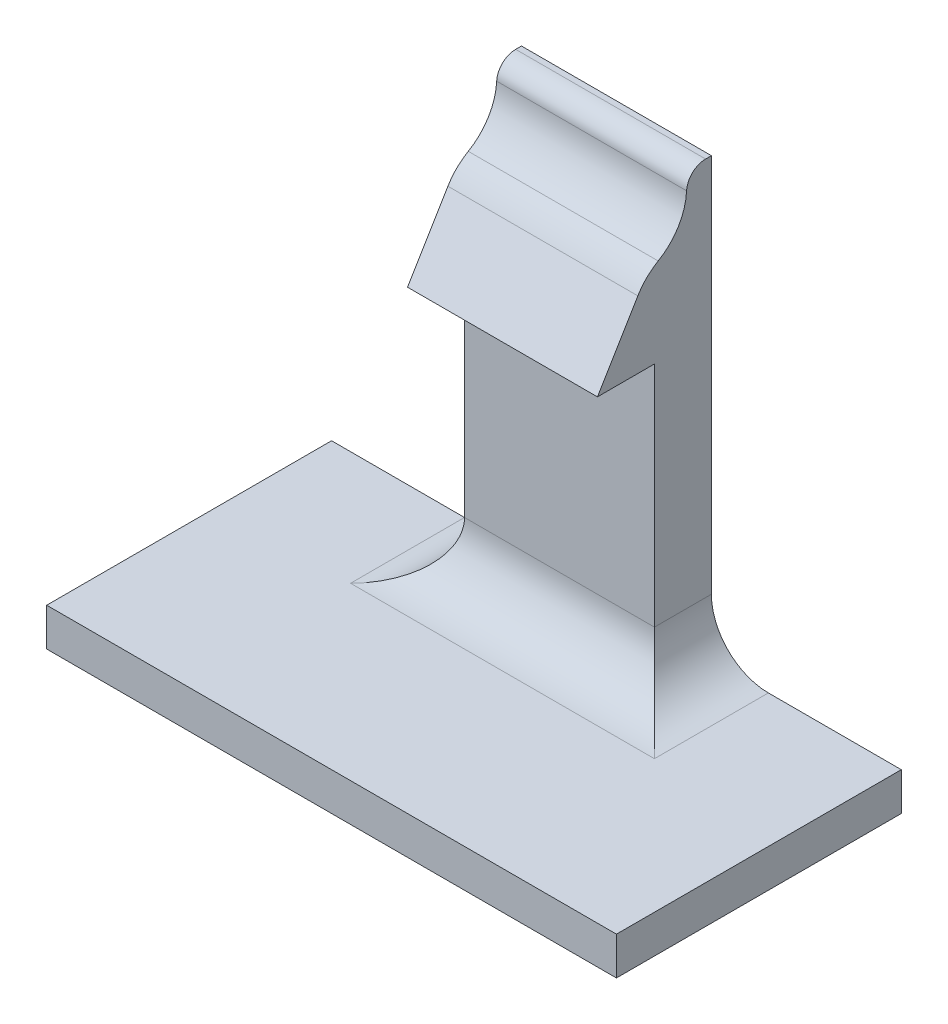
ISO-10303-21;
HEADER;
FILE_DESCRIPTION(('STEP AP214'),'2;1');
FILE_NAME('part.step','',(''),(''),'','','');
FILE_SCHEMA(('AUTOMOTIVE_DESIGN { 1 0 10303 214 1 1 1 1 }'));
ENDSEC;
DATA;
#1=APPLICATION_CONTEXT('core data for automotive mechanical design processes');
#2=APPLICATION_PROTOCOL_DEFINITION('international standard','automotive_design',2000,#1);
#3=PRODUCT_CONTEXT('',#1,'mechanical');
#4=PRODUCT('Part','Part','',(#3));
#5=PRODUCT_RELATED_PRODUCT_CATEGORY('part','',(#4));
#6=PRODUCT_DEFINITION_FORMATION('','',#4);
#7=PRODUCT_DEFINITION_CONTEXT('part definition',#1,'design');
#8=PRODUCT_DEFINITION('design','',#6,#7);
#9=PRODUCT_DEFINITION_SHAPE('','',#8);
#10=(LENGTH_UNIT() NAMED_UNIT(*) SI_UNIT(.MILLI.,.METRE.));
#11=(NAMED_UNIT(*) PLANE_ANGLE_UNIT() SI_UNIT($,.RADIAN.));
#12=(NAMED_UNIT(*) SI_UNIT($,.STERADIAN.) SOLID_ANGLE_UNIT());
#13=UNCERTAINTY_MEASURE_WITH_UNIT(LENGTH_MEASURE(1.E-05),#10,'distance_accuracy_value','');
#14=(GEOMETRIC_REPRESENTATION_CONTEXT(3) GLOBAL_UNCERTAINTY_ASSIGNED_CONTEXT((#13)) GLOBAL_UNIT_ASSIGNED_CONTEXT((#10,
#11,#12)) REPRESENTATION_CONTEXT('',''));
#15=CARTESIAN_POINT('',(0.,0.,0.));
#16=DIRECTION('',(0.,0.,1.));
#17=DIRECTION('',(1.,0.,0.));
#18=AXIS2_PLACEMENT_3D('',#15,#16,#17);
#19=CARTESIAN_POINT('',(15.,2.,-7.5));
#20=DIRECTION('',(-1.,0.,0.));
#21=DIRECTION('',(0.,0.,1.));
#22=AXIS2_PLACEMENT_3D('',#19,#20,#21);
#23=PLANE('',#22);
#24=DIRECTION('',(0.,0.,-1.));
#25=VECTOR('',#24,1.);
#26=CARTESIAN_POINT('',(15.,0.,-7.5));
#27=LINE('',#26,#25);
#28=CARTESIAN_POINT('',(15.,0.,7.5));
#29=VERTEX_POINT('',#28);
#30=CARTESIAN_POINT('',(15.,0.,-7.5));
#31=VERTEX_POINT('',#30);
#32=EDGE_CURVE('E205',#29,#31,#27,.T.);
#33=ORIENTED_EDGE('',*,*,#32,.T.);
#34=DIRECTION('',(0.,-1.,0.));
#35=VECTOR('',#34,1.);
#36=CARTESIAN_POINT('',(15.,2.,-7.5));
#37=LINE('',#36,#35);
#38=CARTESIAN_POINT('',(15.,2.,-7.5));
#39=VERTEX_POINT('',#38);
#40=EDGE_CURVE('E245',#39,#31,#37,.T.);
#41=ORIENTED_EDGE('',*,*,#40,.F.);
#42=DIRECTION('',(0.,0.,-1.));
#43=VECTOR('',#42,1.);
#44=CARTESIAN_POINT('',(15.,2.,-7.5));
#45=LINE('',#44,#43);
#46=CARTESIAN_POINT('',(15.,2.,7.5));
#47=VERTEX_POINT('',#46);
#48=EDGE_CURVE('E206',#47,#39,#45,.T.);
#49=ORIENTED_EDGE('',*,*,#48,.F.);
#50=DIRECTION('',(0.,-1.,0.));
#51=VECTOR('',#50,1.);
#52=CARTESIAN_POINT('',(15.,2.,7.5));
#53=LINE('',#52,#51);
#54=EDGE_CURVE('E222',#47,#29,#53,.T.);
#55=ORIENTED_EDGE('',*,*,#54,.T.);
#56=EDGE_LOOP('',(#33,#41,#49,#55));
#57=FACE_BOUND('',#56,.T.);
#58=ADVANCED_FACE('F39',(#57),#23,.F.);
#59=CARTESIAN_POINT('',(-15.,2.,-7.5));
#60=DIRECTION('',(0.,0.,1.));
#61=DIRECTION('',(1.,0.,0.));
#62=AXIS2_PLACEMENT_3D('',#59,#60,#61);
#63=PLANE('',#62);
#64=DIRECTION('',(-1.,0.,0.));
#65=VECTOR('',#64,1.);
#66=CARTESIAN_POINT('',(-15.,0.,-7.5));
#67=LINE('',#66,#65);
#68=CARTESIAN_POINT('',(-15.,0.,-7.5));
#69=VERTEX_POINT('',#68);
#70=EDGE_CURVE('E226',#31,#69,#67,.T.);
#71=ORIENTED_EDGE('',*,*,#70,.T.);
#72=DIRECTION('',(0.,-1.,0.));
#73=VECTOR('',#72,1.);
#74=CARTESIAN_POINT('',(-15.,2.,-7.5));
#75=LINE('',#74,#73);
#76=CARTESIAN_POINT('',(-15.,2.,-7.5));
#77=VERTEX_POINT('',#76);
#78=EDGE_CURVE('E241',#77,#69,#75,.T.);
#79=ORIENTED_EDGE('',*,*,#78,.F.);
#80=DIRECTION('',(-1.,0.,0.));
#81=VECTOR('',#80,1.);
#82=CARTESIAN_POINT('',(-15.,2.,-7.5));
#83=LINE('',#82,#81);
#84=CARTESIAN_POINT('',(-8.,2.,-7.5));
#85=VERTEX_POINT('',#84);
#86=EDGE_CURVE('E210',#85,#77,#83,.T.);
#87=ORIENTED_EDGE('',*,*,#86,.F.);
#88=CARTESIAN_POINT('',(-8.,5.,-7.5));
#89=DIRECTION('',(0.,0.,1.));
#90=DIRECTION('',(1.,0.,0.));
#91=AXIS2_PLACEMENT_3D('',#88,#89,#90);
#92=CIRCLE('',#91,3.);
#93=CARTESIAN_POINT('',(-5.,5.,-7.5));
#94=VERTEX_POINT('',#93);
#95=EDGE_CURVE('E283',#85,#94,#92,.T.);
#96=ORIENTED_EDGE('',*,*,#95,.T.);
#97=DIRECTION('',(0.,-1.,0.));
#98=VECTOR('',#97,1.);
#99=CARTESIAN_POINT('',(-5.,22.,-7.5));
#100=LINE('',#99,#98);
#101=CARTESIAN_POINT('',(-5.,25.,-7.5));
#102=VERTEX_POINT('',#101);
#103=EDGE_CURVE('E168',#102,#94,#100,.T.);
#104=ORIENTED_EDGE('',*,*,#103,.F.);
#105=DIRECTION('',(-1.,0.,0.));
#106=VECTOR('',#105,1.);
#107=CARTESIAN_POINT('',(-5.,25.,-7.5));
#108=LINE('',#107,#106);
#109=CARTESIAN_POINT('',(5.,25.,-7.5));
#110=VERTEX_POINT('',#109);
#111=EDGE_CURVE('E151',#110,#102,#108,.T.);
#112=ORIENTED_EDGE('',*,*,#111,.F.);
#113=DIRECTION('',(0.,-1.,0.));
#114=VECTOR('',#113,1.);
#115=CARTESIAN_POINT('',(5.,22.,-7.5));
#116=LINE('',#115,#114);
#117=CARTESIAN_POINT('',(5.,5.,-7.5));
#118=VERTEX_POINT('',#117);
#119=EDGE_CURVE('E160',#110,#118,#116,.T.);
#120=ORIENTED_EDGE('',*,*,#119,.T.);
#121=CARTESIAN_POINT('',(8.,5.,-7.5));
#122=DIRECTION('',(0.,0.,1.));
#123=DIRECTION('',(1.,0.,0.));
#124=AXIS2_PLACEMENT_3D('',#121,#122,#123);
#125=CIRCLE('',#124,3.);
#126=CARTESIAN_POINT('',(8.,2.,-7.5));
#127=VERTEX_POINT('',#126);
#128=EDGE_CURVE('E286',#118,#127,#125,.T.);
#129=ORIENTED_EDGE('',*,*,#128,.T.);
#130=EDGE_CURVE('E212',#39,#127,#83,.T.);
#131=ORIENTED_EDGE('',*,*,#130,.F.);
#132=ORIENTED_EDGE('',*,*,#40,.T.);
#133=EDGE_LOOP('',(#71,#79,#87,#96,#104,#112,#120,#129,#131,#132));
#134=FACE_BOUND('',#133,.T.);
#135=ADVANCED_FACE('F170',(#134),#63,.F.);
#136=CARTESIAN_POINT('',(-15.,2.,-7.5));
#137=DIRECTION('',(1.,0.,0.));
#138=DIRECTION('',(0.,0.,-1.));
#139=AXIS2_PLACEMENT_3D('',#136,#137,#138);
#140=PLANE('',#139);
#141=DIRECTION('',(0.,0.,1.));
#142=VECTOR('',#141,1.);
#143=CARTESIAN_POINT('',(-15.,0.,-7.5));
#144=LINE('',#143,#142);
#145=CARTESIAN_POINT('',(-15.,0.,7.5));
#146=VERTEX_POINT('',#145);
#147=EDGE_CURVE('E229',#69,#146,#144,.T.);
#148=ORIENTED_EDGE('',*,*,#147,.T.);
#149=DIRECTION('',(0.,-1.,0.));
#150=VECTOR('',#149,1.);
#151=CARTESIAN_POINT('',(-15.,2.,7.5));
#152=LINE('',#151,#150);
#153=CARTESIAN_POINT('',(-15.,2.,7.5));
#154=VERTEX_POINT('',#153);
#155=EDGE_CURVE('E237',#154,#146,#152,.T.);
#156=ORIENTED_EDGE('',*,*,#155,.F.);
#157=DIRECTION('',(0.,0.,1.));
#158=VECTOR('',#157,1.);
#159=CARTESIAN_POINT('',(-15.,2.,-7.5));
#160=LINE('',#159,#158);
#161=EDGE_CURVE('E216',#77,#154,#160,.T.);
#162=ORIENTED_EDGE('',*,*,#161,.F.);
#163=ORIENTED_EDGE('',*,*,#78,.T.);
#164=EDGE_LOOP('',(#148,#156,#162,#163));
#165=FACE_BOUND('',#164,.T.);
#166=ADVANCED_FACE('F316',(#165),#140,.F.);
#167=CARTESIAN_POINT('',(-15.,2.,7.5));
#168=DIRECTION('',(0.,0.,-1.));
#169=DIRECTION('',(-1.,0.,0.));
#170=AXIS2_PLACEMENT_3D('',#167,#168,#169);
#171=PLANE('',#170);
#172=DIRECTION('',(1.,0.,0.));
#173=VECTOR('',#172,1.);
#174=CARTESIAN_POINT('',(-15.,0.,7.5));
#175=LINE('',#174,#173);
#176=EDGE_CURVE('E211',#146,#29,#175,.T.);
#177=ORIENTED_EDGE('',*,*,#176,.T.);
#178=ORIENTED_EDGE('',*,*,#54,.F.);
#179=DIRECTION('',(1.,0.,0.));
#180=VECTOR('',#179,1.);
#181=CARTESIAN_POINT('',(-15.,2.,7.5));
#182=LINE('',#181,#180);
#183=EDGE_CURVE('E219',#154,#47,#182,.T.);
#184=ORIENTED_EDGE('',*,*,#183,.F.);
#185=ORIENTED_EDGE('',*,*,#155,.T.);
#186=EDGE_LOOP('',(#177,#178,#184,#185));
#187=FACE_BOUND('',#186,.T.);
#188=ADVANCED_FACE('F321',(#187),#171,.F.);
#189=CARTESIAN_POINT('',(0.,2.,0.));
#190=DIRECTION('',(0.,1.,0.));
#191=DIRECTION('',(0.,0.,1.));
#192=AXIS2_PLACEMENT_3D('',#189,#190,#191);
#193=PLANE('',#192);
#194=DIRECTION('',(1.,0.,0.));
#195=VECTOR('',#194,1.);
#196=CARTESIAN_POINT('',(0.,2.,-1.5));
#197=LINE('',#196,#195);
#198=CARTESIAN_POINT('',(8.,2.,-1.5));
#199=VERTEX_POINT('',#198);
#200=CARTESIAN_POINT('',(-8.,2.,-1.5));
#201=VERTEX_POINT('',#200);
#202=EDGE_CURVE('E263',#199,#201,#197,.F.);
#203=ORIENTED_EDGE('',*,*,#202,.T.);
#204=DIRECTION('',(0.,0.,1.));
#205=VECTOR('',#204,1.);
#206=CARTESIAN_POINT('',(-8.,2.,0.));
#207=LINE('',#206,#205);
#208=EDGE_CURVE('E274',#201,#85,#207,.F.);
#209=ORIENTED_EDGE('',*,*,#208,.T.);
#210=ORIENTED_EDGE('',*,*,#86,.T.);
#211=ORIENTED_EDGE('',*,*,#161,.T.);
#212=ORIENTED_EDGE('',*,*,#183,.T.);
#213=ORIENTED_EDGE('',*,*,#48,.T.);
#214=ORIENTED_EDGE('',*,*,#130,.T.);
#215=DIRECTION('',(0.,0.,-1.));
#216=VECTOR('',#215,1.);
#217=CARTESIAN_POINT('',(8.,2.,0.));
#218=LINE('',#217,#216);
#219=EDGE_CURVE('E270',#127,#199,#218,.F.);
#220=ORIENTED_EDGE('',*,*,#219,.T.);
#221=EDGE_LOOP('',(#203,#209,#210,#211,#212,#213,#214,#220));
#222=FACE_BOUND('',#221,.T.);
#223=ADVANCED_FACE('F309',(#222),#193,.T.);
#224=CARTESIAN_POINT('',(0.,0.,0.));
#225=DIRECTION('',(0.,1.,0.));
#226=DIRECTION('',(0.,0.,1.));
#227=AXIS2_PLACEMENT_3D('',#224,#225,#226);
#228=PLANE('',#227);
#229=ORIENTED_EDGE('',*,*,#32,.F.);
#230=ORIENTED_EDGE('',*,*,#176,.F.);
#231=ORIENTED_EDGE('',*,*,#147,.F.);
#232=ORIENTED_EDGE('',*,*,#70,.F.);
#233=EDGE_LOOP('',(#229,#230,#231,#232));
#234=FACE_BOUND('',#233,.T.);
#235=ADVANCED_FACE('F387',(#234),#228,.F.);
#236=CARTESIAN_POINT('',(-5.,22.,-7.5));
#237=DIRECTION('',(1.,0.,0.));
#238=DIRECTION('',(0.,0.,-1.));
#239=AXIS2_PLACEMENT_3D('',#236,#237,#238);
#240=PLANE('',#239);
#241=CARTESIAN_POINT('',(-5.,24.1961524227066,-3.19857113690718));
#242=DIRECTION('',(1.,0.,0.));
#243=DIRECTION('',(0.,0.,-1.));
#244=AXIS2_PLACEMENT_3D('',#241,#242,#243);
#245=CIRCLE('',#244,3.);
#246=CARTESIAN_POINT('',(-5.,21.5980762113533,-4.69857113690718));
#247=VERTEX_POINT('',#246);
#248=CARTESIAN_POINT('',(-5.,24.0490381056767,-6.19496186205048));
#249=VERTEX_POINT('',#248);
#250=EDGE_CURVE('E298',#247,#249,#245,.T.);
#251=ORIENTED_EDGE('',*,*,#250,.T.);
#252=CARTESIAN_POINT('',(-5.,24.,-7.19375877043158));
#253=DIRECTION('',(1.,0.,0.));
#254=DIRECTION('',(0.,0.,-1.));
#255=AXIS2_PLACEMENT_3D('',#252,#253,#254);
#256=CIRCLE('',#255,1.);
#257=CARTESIAN_POINT('',(-5.,25.,-7.19375877043158));
#258=VERTEX_POINT('',#257);
#259=EDGE_CURVE('E11',#249,#258,#256,.F.);
#260=ORIENTED_EDGE('',*,*,#259,.T.);
#261=DIRECTION('',(0.,0.,1.));
#262=VECTOR('',#261,1.);
#263=CARTESIAN_POINT('',(-5.,25.,-7.5));
#264=LINE('',#263,#262);
#265=EDGE_CURVE('E156',#102,#258,#264,.T.);
#266=ORIENTED_EDGE('',*,*,#265,.F.);
#267=ORIENTED_EDGE('',*,*,#103,.T.);
#268=DIRECTION('',(0.,0.,1.));
#269=VECTOR('',#268,1.);
#270=CARTESIAN_POINT('',(-5.,5.,-7.5));
#271=LINE('',#270,#269);
#272=CARTESIAN_POINT('',(-5.,5.,-4.5));
#273=VERTEX_POINT('',#272);
#274=EDGE_CURVE('E266',#94,#273,#271,.T.);
#275=ORIENTED_EDGE('',*,*,#274,.T.);
#276=DIRECTION('',(0.,-1.,0.));
#277=VECTOR('',#276,1.);
#278=CARTESIAN_POINT('',(-5.,22.,-4.5));
#279=LINE('',#278,#277);
#280=CARTESIAN_POINT('',(-5.,17.,-4.5));
#281=VERTEX_POINT('',#280);
#282=EDGE_CURVE('E201',#281,#273,#279,.T.);
#283=ORIENTED_EDGE('',*,*,#282,.F.);
#284=DIRECTION('',(0.,0.,1.));
#285=VECTOR('',#284,1.);
#286=CARTESIAN_POINT('',(-5.,17.,-1.5));
#287=LINE('',#286,#285);
#288=CARTESIAN_POINT('',(-5.,17.,-1.5));
#289=VERTEX_POINT('',#288);
#290=EDGE_CURVE('E173',#281,#289,#287,.T.);
#291=ORIENTED_EDGE('',*,*,#290,.T.);
#292=DIRECTION('',(0.,0.857492925712544,-0.514495755427526));
#293=VECTOR('',#292,1.);
#294=CARTESIAN_POINT('',(-5.,22.,-4.5));
#295=LINE('',#294,#293);
#296=CARTESIAN_POINT('',(-5.,20.5434872662826,-3.62609235976955));
#297=VERTEX_POINT('',#296);
#298=EDGE_CURVE('E177',#289,#297,#295,.T.);
#299=ORIENTED_EDGE('',*,*,#298,.T.);
#300=CARTESIAN_POINT('',(-5.,19.,-6.19857113690718));
#301=DIRECTION('',(1.,0.,0.));
#302=DIRECTION('',(0.,0.,-1.));
#303=AXIS2_PLACEMENT_3D('',#300,#301,#302);
#304=CIRCLE('',#303,3.);
#305=EDGE_CURVE('E255',#297,#247,#304,.F.);
#306=ORIENTED_EDGE('',*,*,#305,.T.);
#307=EDGE_LOOP('',(#251,#260,#266,#267,#275,#283,#291,#299,#306));
#308=FACE_BOUND('',#307,.T.);
#309=ADVANCED_FACE('F337',(#308),#240,.F.);
#310=CARTESIAN_POINT('',(-5.,22.,-4.5));
#311=DIRECTION('',(0.,0.,-1.));
#312=DIRECTION('',(-1.,0.,0.));
#313=AXIS2_PLACEMENT_3D('',#310,#311,#312);
#314=PLANE('',#313);
#315=ORIENTED_EDGE('',*,*,#282,.T.);
#316=DIRECTION('',(1.,0.,0.));
#317=VECTOR('',#316,1.);
#318=CARTESIAN_POINT('',(-5.,5.,-4.5));
#319=LINE('',#318,#317);
#320=CARTESIAN_POINT('',(5.,5.,-4.5));
#321=VERTEX_POINT('',#320);
#322=EDGE_CURVE('E259',#273,#321,#319,.T.);
#323=ORIENTED_EDGE('',*,*,#322,.T.);
#324=DIRECTION('',(0.,-1.,0.));
#325=VECTOR('',#324,1.);
#326=CARTESIAN_POINT('',(5.,22.,-4.5));
#327=LINE('',#326,#325);
#328=CARTESIAN_POINT('',(5.,17.,-4.5));
#329=VERTEX_POINT('',#328);
#330=EDGE_CURVE('E167',#329,#321,#327,.T.);
#331=ORIENTED_EDGE('',*,*,#330,.F.);
#332=DIRECTION('',(-1.,0.,0.));
#333=VECTOR('',#332,1.);
#334=CARTESIAN_POINT('',(10.8309518948453,17.,-4.5));
#335=LINE('',#334,#333);
#336=EDGE_CURVE('E189',#329,#281,#335,.T.);
#337=ORIENTED_EDGE('',*,*,#336,.T.);
#338=EDGE_LOOP('',(#315,#323,#331,#337));
#339=FACE_BOUND('',#338,.T.);
#340=ADVANCED_FACE('F381',(#339),#314,.F.);
#341=CARTESIAN_POINT('',(5.,22.,-7.5));
#342=DIRECTION('',(-1.,0.,0.));
#343=DIRECTION('',(0.,0.,1.));
#344=AXIS2_PLACEMENT_3D('',#341,#342,#343);
#345=PLANE('',#344);
#346=DIRECTION('',(0.,0.,-1.));
#347=VECTOR('',#346,1.);
#348=CARTESIAN_POINT('',(5.,25.,-7.5));
#349=LINE('',#348,#347);
#350=CARTESIAN_POINT('',(5.,25.,-7.19375877043158));
#351=VERTEX_POINT('',#350);
#352=EDGE_CURVE('E146',#351,#110,#349,.T.);
#353=ORIENTED_EDGE('',*,*,#352,.F.);
#354=CARTESIAN_POINT('',(5.,24.,-7.19375877043158));
#355=DIRECTION('',(-1.,0.,0.));
#356=DIRECTION('',(0.,0.,1.));
#357=AXIS2_PLACEMENT_3D('',#354,#355,#356);
#358=CIRCLE('',#357,1.);
#359=CARTESIAN_POINT('',(5.,24.0490381056767,-6.19496186205048));
#360=VERTEX_POINT('',#359);
#361=EDGE_CURVE('E62',#351,#360,#358,.F.);
#362=ORIENTED_EDGE('',*,*,#361,.T.);
#363=CARTESIAN_POINT('',(5.,24.1961524227066,-3.19857113690718));
#364=DIRECTION('',(-1.,0.,0.));
#365=DIRECTION('',(0.,0.,1.));
#366=AXIS2_PLACEMENT_3D('',#363,#364,#365);
#367=CIRCLE('',#366,3.);
#368=CARTESIAN_POINT('',(5.,21.5980762113533,-4.69857113690717));
#369=VERTEX_POINT('',#368);
#370=EDGE_CURVE('E295',#360,#369,#367,.T.);
#371=ORIENTED_EDGE('',*,*,#370,.T.);
#372=CARTESIAN_POINT('',(5.,19.,-6.19857113690718));
#373=DIRECTION('',(-1.,0.,0.));
#374=DIRECTION('',(0.,0.,1.));
#375=AXIS2_PLACEMENT_3D('',#372,#373,#374);
#376=CIRCLE('',#375,3.);
#377=CARTESIAN_POINT('',(5.,20.5434872662826,-3.62609235976954));
#378=VERTEX_POINT('',#377);
#379=EDGE_CURVE('E249',#369,#378,#376,.F.);
#380=ORIENTED_EDGE('',*,*,#379,.T.);
#381=DIRECTION('',(0.,-0.857492925712544,0.514495755427526));
#382=VECTOR('',#381,1.);
#383=CARTESIAN_POINT('',(5.,22.,-4.5));
#384=LINE('',#383,#382);
#385=CARTESIAN_POINT('',(5.,17.,-1.5));
#386=VERTEX_POINT('',#385);
#387=EDGE_CURVE('E181',#378,#386,#384,.T.);
#388=ORIENTED_EDGE('',*,*,#387,.T.);
#389=DIRECTION('',(0.,0.,-1.));
#390=VECTOR('',#389,1.);
#391=CARTESIAN_POINT('',(5.,17.,-1.49999999999999));
#392=LINE('',#391,#390);
#393=EDGE_CURVE('E183',#386,#329,#392,.T.);
#394=ORIENTED_EDGE('',*,*,#393,.T.);
#395=ORIENTED_EDGE('',*,*,#330,.T.);
#396=DIRECTION('',(0.,0.,-1.));
#397=VECTOR('',#396,1.);
#398=CARTESIAN_POINT('',(5.,5.,-7.5));
#399=LINE('',#398,#397);
#400=EDGE_CURVE('E164',#321,#118,#399,.T.);
#401=ORIENTED_EDGE('',*,*,#400,.T.);
#402=ORIENTED_EDGE('',*,*,#119,.F.);
#403=EDGE_LOOP('',(#353,#362,#371,#380,#388,#394,#395,#401,#402));
#404=FACE_BOUND('',#403,.T.);
#405=ADVANCED_FACE('F161',(#404),#345,.F.);
#406=CARTESIAN_POINT('',(10.8309518948453,22.,-4.5));
#407=DIRECTION('',(0.,0.514495755427526,0.857492925712544));
#408=DIRECTION('',(0.,-0.857492925712544,0.514495755427526));
#409=AXIS2_PLACEMENT_3D('',#406,#407,#408);
#410=PLANE('',#409);
#411=ORIENTED_EDGE('',*,*,#387,.F.);
#412=DIRECTION('',(1.,0.,0.));
#413=VECTOR('',#412,1.);
#414=CARTESIAN_POINT('',(10.8309518948453,20.5434872662826,-3.62609235976954));
#415=LINE('',#414,#413);
#416=EDGE_CURVE('E252',#378,#297,#415,.F.);
#417=ORIENTED_EDGE('',*,*,#416,.T.);
#418=ORIENTED_EDGE('',*,*,#298,.F.);
#419=DIRECTION('',(-1.,0.,0.));
#420=VECTOR('',#419,1.);
#421=CARTESIAN_POINT('',(10.8309518948453,17.,-1.5));
#422=LINE('',#421,#420);
#423=EDGE_CURVE('E184',#386,#289,#422,.T.);
#424=ORIENTED_EDGE('',*,*,#423,.F.);
#425=EDGE_LOOP('',(#411,#417,#418,#424));
#426=FACE_BOUND('',#425,.T.);
#427=ADVANCED_FACE('F372',(#426),#410,.T.);
#428=CARTESIAN_POINT('',(10.8309518948453,17.,-1.5));
#429=DIRECTION('',(0.,-1.,0.));
#430=DIRECTION('',(0.,0.,-1.));
#431=AXIS2_PLACEMENT_3D('',#428,#429,#430);
#432=PLANE('',#431);
#433=ORIENTED_EDGE('',*,*,#393,.F.);
#434=ORIENTED_EDGE('',*,*,#423,.T.);
#435=ORIENTED_EDGE('',*,*,#290,.F.);
#436=ORIENTED_EDGE('',*,*,#336,.F.);
#437=EDGE_LOOP('',(#433,#434,#435,#436));
#438=FACE_BOUND('',#437,.T.);
#439=ADVANCED_FACE('F358',(#438),#432,.T.);
#440=CARTESIAN_POINT('',(0.,19.,-6.19857113690718));
#441=DIRECTION('',(1.,0.,0.));
#442=DIRECTION('',(0.,0.,-1.));
#443=AXIS2_PLACEMENT_3D('',#440,#441,#442);
#444=CYLINDRICAL_SURFACE('',#443,3.);
#445=ORIENTED_EDGE('',*,*,#379,.F.);
#446=DIRECTION('',(1.,0.,0.));
#447=VECTOR('',#446,1.);
#448=CARTESIAN_POINT('',(0.,21.5980762113533,-4.69857113690718));
#449=LINE('',#448,#447);
#450=EDGE_CURVE('E292',#369,#247,#449,.F.);
#451=ORIENTED_EDGE('',*,*,#450,.T.);
#452=ORIENTED_EDGE('',*,*,#305,.F.);
#453=ORIENTED_EDGE('',*,*,#416,.F.);
#454=EDGE_LOOP('',(#445,#451,#452,#453));
#455=FACE_BOUND('',#454,.T.);
#456=ADVANCED_FACE('F355',(#455),#444,.T.);
#457=CARTESIAN_POINT('',(-5.,5.,-1.5));
#458=DIRECTION('',(1.,0.,0.));
#459=DIRECTION('',(0.,0.,-1.));
#460=AXIS2_PLACEMENT_3D('',#457,#458,#459);
#461=CYLINDRICAL_SURFACE('',#460,3.);
#462=ORIENTED_EDGE('',*,*,#322,.F.);
#463=CARTESIAN_POINT('',(-8.,5.,-1.5));
#464=DIRECTION('',(0.707106781186547,0.,0.707106781186548));
#465=DIRECTION('',(0.707106781186548,0.,-0.707106781186547));
#466=AXIS2_PLACEMENT_3D('',#463,#464,#465);
#467=ELLIPSE('',#466,4.24264068711929,3.);
#468=EDGE_CURVE('E279',#273,#201,#467,.F.);
#469=ORIENTED_EDGE('',*,*,#468,.T.);
#470=ORIENTED_EDGE('',*,*,#202,.F.);
#471=CARTESIAN_POINT('',(8.,5.,-1.5));
#472=DIRECTION('',(0.707106781186547,0.,-0.707106781186548));
#473=DIRECTION('',(0.707106781186548,0.,0.707106781186547));
#474=AXIS2_PLACEMENT_3D('',#471,#472,#473);
#475=ELLIPSE('',#474,4.24264068711929,3.);
#476=EDGE_CURVE('E289',#199,#321,#475,.T.);
#477=ORIENTED_EDGE('',*,*,#476,.T.);
#478=EDGE_LOOP('',(#462,#469,#470,#477));
#479=FACE_BOUND('',#478,.T.);
#480=ADVANCED_FACE('F332',(#479),#461,.F.);
#481=CARTESIAN_POINT('',(-8.,5.,-7.5));
#482=DIRECTION('',(0.,0.,1.));
#483=DIRECTION('',(1.,0.,0.));
#484=AXIS2_PLACEMENT_3D('',#481,#482,#483);
#485=CYLINDRICAL_SURFACE('',#484,3.);
#486=ORIENTED_EDGE('',*,*,#95,.F.);
#487=ORIENTED_EDGE('',*,*,#208,.F.);
#488=ORIENTED_EDGE('',*,*,#468,.F.);
#489=ORIENTED_EDGE('',*,*,#274,.F.);
#490=EDGE_LOOP('',(#486,#487,#488,#489));
#491=FACE_BOUND('',#490,.T.);
#492=ADVANCED_FACE('F335',(#491),#485,.F.);
#493=CARTESIAN_POINT('',(8.,5.,-7.5));
#494=DIRECTION('',(0.,0.,-1.));
#495=DIRECTION('',(-1.,0.,0.));
#496=AXIS2_PLACEMENT_3D('',#493,#494,#495);
#497=CYLINDRICAL_SURFACE('',#496,3.);
#498=ORIENTED_EDGE('',*,*,#476,.F.);
#499=ORIENTED_EDGE('',*,*,#219,.F.);
#500=ORIENTED_EDGE('',*,*,#128,.F.);
#501=ORIENTED_EDGE('',*,*,#400,.F.);
#502=EDGE_LOOP('',(#498,#499,#500,#501));
#503=FACE_BOUND('',#502,.T.);
#504=ADVANCED_FACE('F329',(#503),#497,.F.);
#505=CARTESIAN_POINT('',(0.,25.,0.));
#506=DIRECTION('',(0.,1.,0.));
#507=DIRECTION('',(0.,0.,1.));
#508=AXIS2_PLACEMENT_3D('',#505,#506,#507);
#509=PLANE('',#508);
#510=ORIENTED_EDGE('',*,*,#265,.T.);
#511=DIRECTION('',(-1.,0.,0.));
#512=VECTOR('',#511,1.);
#513=CARTESIAN_POINT('',(5.,25.,-7.19375877043158));
#514=LINE('',#513,#512);
#515=EDGE_CURVE('E154',#258,#351,#514,.F.);
#516=ORIENTED_EDGE('',*,*,#515,.T.);
#517=ORIENTED_EDGE('',*,*,#352,.T.);
#518=ORIENTED_EDGE('',*,*,#111,.T.);
#519=EDGE_LOOP('',(#510,#516,#517,#518));
#520=FACE_BOUND('',#519,.T.);
#521=ADVANCED_FACE('F149',(#520),#509,.T.);
#522=CARTESIAN_POINT('',(0.,24.1961524227066,-3.19857113690718));
#523=DIRECTION('',(1.,0.,0.));
#524=DIRECTION('',(0.,0.,-1.));
#525=AXIS2_PLACEMENT_3D('',#522,#523,#524);
#526=CYLINDRICAL_SURFACE('',#525,3.);
#527=ORIENTED_EDGE('',*,*,#370,.F.);
#528=DIRECTION('',(1.,0.,0.));
#529=VECTOR('',#528,1.);
#530=CARTESIAN_POINT('',(0.,24.0490381056767,-6.19496186205048));
#531=LINE('',#530,#529);
#532=EDGE_CURVE('E48',#360,#249,#531,.F.);
#533=ORIENTED_EDGE('',*,*,#532,.T.);
#534=ORIENTED_EDGE('',*,*,#250,.F.);
#535=ORIENTED_EDGE('',*,*,#450,.F.);
#536=EDGE_LOOP('',(#527,#533,#534,#535));
#537=FACE_BOUND('',#536,.T.);
#538=ADVANCED_FACE('F343',(#537),#526,.F.);
#539=CARTESIAN_POINT('',(0.,24.,-7.19375877043158));
#540=DIRECTION('',(1.,0.,0.));
#541=DIRECTION('',(0.,0.,-1.));
#542=AXIS2_PLACEMENT_3D('',#539,#540,#541);
#543=CYLINDRICAL_SURFACE('',#542,1.);
#544=ORIENTED_EDGE('',*,*,#259,.F.);
#545=ORIENTED_EDGE('',*,*,#532,.F.);
#546=ORIENTED_EDGE('',*,*,#361,.F.);
#547=ORIENTED_EDGE('',*,*,#515,.F.);
#548=EDGE_LOOP('',(#544,#545,#546,#547));
#549=FACE_BOUND('',#548,.T.);
#550=ADVANCED_FACE('F41',(#549),#543,.T.);
#551=CLOSED_SHELL('',(#58,#135,#166,#188,#223,#235,#309,#340,#405,#427,#439,#456,#480,#492,#504,
#521,#538,#550));
#552=MANIFOLD_SOLID_BREP('B2',#551);
#553=ADVANCED_BREP_SHAPE_REPRESENTATION('',(#18,#552),#14);
#554=SHAPE_DEFINITION_REPRESENTATION(#9,#553);
ENDSEC;
END-ISO-10303-21;
